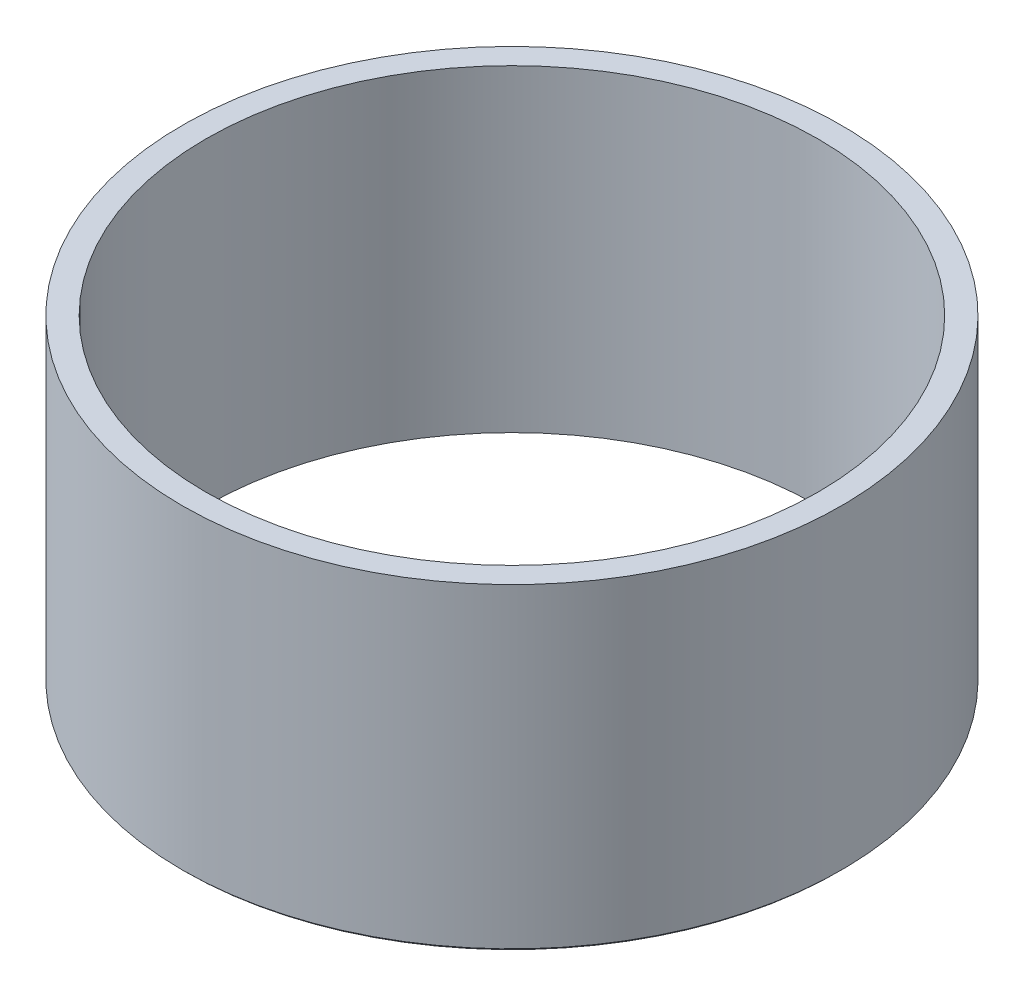
ISO-10303-21;
HEADER;
FILE_DESCRIPTION(('STEP AP214'),'2;1');
FILE_NAME('part.step','',(''),(''),'','','');
FILE_SCHEMA(('AUTOMOTIVE_DESIGN { 1 0 10303 214 1 1 1 1 }'));
ENDSEC;
DATA;
#1=APPLICATION_CONTEXT('core data for automotive mechanical design processes');
#2=APPLICATION_PROTOCOL_DEFINITION('international standard','automotive_design',2000,#1);
#3=PRODUCT_CONTEXT('',#1,'mechanical');
#4=PRODUCT('Part','Part','',(#3));
#5=PRODUCT_RELATED_PRODUCT_CATEGORY('part','',(#4));
#6=PRODUCT_DEFINITION_FORMATION('','',#4);
#7=PRODUCT_DEFINITION_CONTEXT('part definition',#1,'design');
#8=PRODUCT_DEFINITION('design','',#6,#7);
#9=PRODUCT_DEFINITION_SHAPE('','',#8);
#10=(LENGTH_UNIT() NAMED_UNIT(*) SI_UNIT(.MILLI.,.METRE.));
#11=(NAMED_UNIT(*) PLANE_ANGLE_UNIT() SI_UNIT($,.RADIAN.));
#12=(NAMED_UNIT(*) SI_UNIT($,.STERADIAN.) SOLID_ANGLE_UNIT());
#13=UNCERTAINTY_MEASURE_WITH_UNIT(LENGTH_MEASURE(1.E-05),#10,'distance_accuracy_value','');
#14=(GEOMETRIC_REPRESENTATION_CONTEXT(3) GLOBAL_UNCERTAINTY_ASSIGNED_CONTEXT((#13)) GLOBAL_UNIT_ASSIGNED_CONTEXT((#10,
#11,#12)) REPRESENTATION_CONTEXT('',''));
#15=CARTESIAN_POINT('',(0.,0.,0.));
#16=DIRECTION('',(0.,0.,1.));
#17=DIRECTION('',(1.,0.,0.));
#18=AXIS2_PLACEMENT_3D('',#15,#16,#17);
#19=CARTESIAN_POINT('',(0.,13.5,0.));
#20=DIRECTION('',(0.,1.,0.));
#21=DIRECTION('',(0.,0.,1.));
#22=AXIS2_PLACEMENT_3D('',#19,#20,#21);
#23=PLANE('',#22);
#24=CARTESIAN_POINT('',(0.,13.5,0.));
#25=DIRECTION('',(0.,1.,0.));
#26=DIRECTION('',(0.,0.,1.));
#27=AXIS2_PLACEMENT_3D('',#24,#25,#26);
#28=CIRCLE('',#27,14.);
#29=CARTESIAN_POINT('',(0.,13.5,14.));
#30=VERTEX_POINT('',#29);
#31=EDGE_CURVE('E44',#30,#30,#28,.T.);
#32=ORIENTED_EDGE('',*,*,#31,.T.);
#33=EDGE_LOOP('',(#32));
#34=FACE_BOUND('',#33,.T.);
#35=CARTESIAN_POINT('',(0.,13.5,0.));
#36=DIRECTION('',(0.,1.,0.));
#37=DIRECTION('',(0.,0.,1.));
#38=AXIS2_PLACEMENT_3D('',#35,#36,#37);
#39=CIRCLE('',#38,13.);
#40=CARTESIAN_POINT('',(0.,13.5,13.));
#41=VERTEX_POINT('',#40);
#42=EDGE_CURVE('E48',#41,#41,#39,.T.);
#43=ORIENTED_EDGE('',*,*,#42,.F.);
#44=EDGE_LOOP('',(#43));
#45=FACE_BOUND('',#44,.T.);
#46=ADVANCED_FACE('F33',(#34,#45),#23,.T.);
#47=CARTESIAN_POINT('',(0.,0.,0.));
#48=DIRECTION('',(0.,1.,0.));
#49=DIRECTION('',(0.,0.,1.));
#50=AXIS2_PLACEMENT_3D('',#47,#48,#49);
#51=PLANE('',#50);
#52=CARTESIAN_POINT('',(0.,0.,0.));
#53=DIRECTION('',(0.,1.,0.));
#54=DIRECTION('',(0.,0.,1.));
#55=AXIS2_PLACEMENT_3D('',#52,#53,#54);
#56=CIRCLE('',#55,13.9);
#57=CARTESIAN_POINT('',(0.,0.,13.9));
#58=VERTEX_POINT('',#57);
#59=EDGE_CURVE('E10',#58,#58,#56,.F.);
#60=ORIENTED_EDGE('',*,*,#59,.T.);
#61=EDGE_LOOP('',(#60));
#62=FACE_BOUND('',#61,.T.);
#63=CARTESIAN_POINT('',(0.,0.,0.));
#64=DIRECTION('',(0.,1.,0.));
#65=DIRECTION('',(0.,0.,1.));
#66=AXIS2_PLACEMENT_3D('',#63,#64,#65);
#67=CIRCLE('',#66,13.);
#68=CARTESIAN_POINT('',(0.,0.,13.));
#69=VERTEX_POINT('',#68);
#70=EDGE_CURVE('E51',#69,#69,#67,.T.);
#71=ORIENTED_EDGE('',*,*,#70,.T.);
#72=EDGE_LOOP('',(#71));
#73=FACE_BOUND('',#72,.T.);
#74=ADVANCED_FACE('F61',(#62,#73),#51,.F.);
#75=CARTESIAN_POINT('',(0.,13.5,0.));
#76=DIRECTION('',(0.,-1.,0.));
#77=DIRECTION('',(0.,0.,-1.));
#78=AXIS2_PLACEMENT_3D('',#75,#76,#77);
#79=CYLINDRICAL_SURFACE('',#78,14.);
#80=CARTESIAN_POINT('',(0.,0.0999999999999977,0.));
#81=DIRECTION('',(0.,1.,0.));
#82=DIRECTION('',(0.,0.,1.));
#83=AXIS2_PLACEMENT_3D('',#80,#81,#82);
#84=CIRCLE('',#83,14.);
#85=CARTESIAN_POINT('',(0.,0.0999999999999977,14.));
#86=VERTEX_POINT('',#85);
#87=EDGE_CURVE('E40',#86,#86,#84,.T.);
#88=ORIENTED_EDGE('',*,*,#87,.T.);
#89=EDGE_LOOP('',(#88));
#90=FACE_BOUND('',#89,.T.);
#91=ORIENTED_EDGE('',*,*,#31,.F.);
#92=EDGE_LOOP('',(#91));
#93=FACE_BOUND('',#92,.T.);
#94=ADVANCED_FACE('F67',(#90,#93),#79,.T.);
#95=CARTESIAN_POINT('',(0.,13.5,0.));
#96=DIRECTION('',(0.,-1.,0.));
#97=DIRECTION('',(0.,0.,-1.));
#98=AXIS2_PLACEMENT_3D('',#95,#96,#97);
#99=CYLINDRICAL_SURFACE('',#98,13.);
#100=ORIENTED_EDGE('',*,*,#42,.T.);
#101=EDGE_LOOP('',(#100));
#102=FACE_BOUND('',#101,.T.);
#103=ORIENTED_EDGE('',*,*,#70,.F.);
#104=EDGE_LOOP('',(#103));
#105=FACE_BOUND('',#104,.T.);
#106=ADVANCED_FACE('F57',(#102,#105),#99,.F.);
#107=CARTESIAN_POINT('',(0.,0.0999999999999977,0.));
#108=DIRECTION('',(0.,1.,0.));
#109=DIRECTION('',(0.,0.,1.));
#110=AXIS2_PLACEMENT_3D('',#107,#108,#109);
#111=CONICAL_SURFACE('',#110,14.,0.785398163397466);
#112=ORIENTED_EDGE('',*,*,#59,.F.);
#113=EDGE_LOOP('',(#112));
#114=FACE_BOUND('',#113,.T.);
#115=ORIENTED_EDGE('',*,*,#87,.F.);
#116=EDGE_LOOP('',(#115));
#117=FACE_BOUND('',#116,.T.);
#118=ADVANCED_FACE('F35',(#114,#117),#111,.T.);
#119=CLOSED_SHELL('',(#46,#74,#94,#106,#118));
#120=MANIFOLD_SOLID_BREP('B2',#119);
#121=ADVANCED_BREP_SHAPE_REPRESENTATION('',(#18,#120),#14);
#122=SHAPE_DEFINITION_REPRESENTATION(#9,#121);
ENDSEC;
END-ISO-10303-21;
